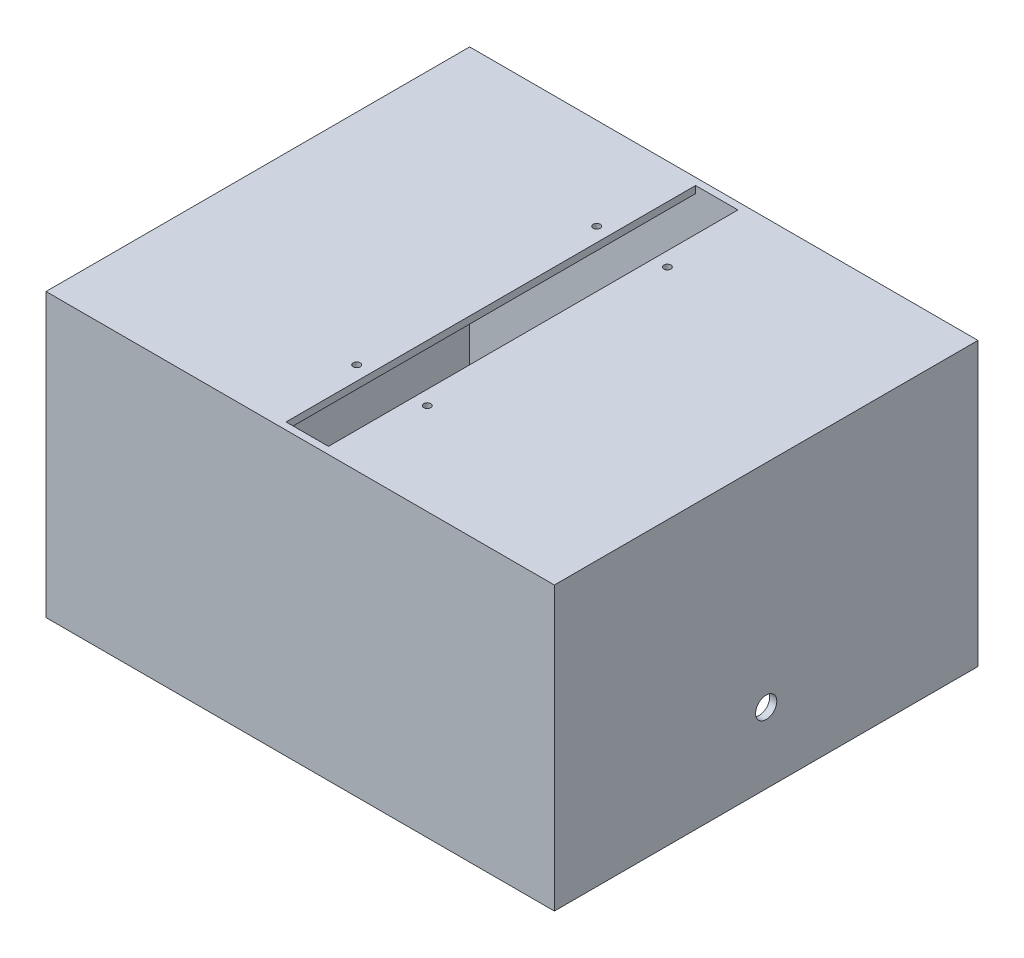
ISO-10303-21;
HEADER;
FILE_DESCRIPTION(('STEP AP214'),'2;1');
FILE_NAME('part.step','',(''),(''),'','','');
FILE_SCHEMA(('AUTOMOTIVE_DESIGN { 1 0 10303 214 1 1 1 1 }'));
ENDSEC;
DATA;
#1=APPLICATION_CONTEXT('core data for automotive mechanical design processes');
#2=APPLICATION_PROTOCOL_DEFINITION('international standard','automotive_design',2000,#1);
#3=PRODUCT_CONTEXT('',#1,'mechanical');
#4=PRODUCT('Part','Part','',(#3));
#5=PRODUCT_RELATED_PRODUCT_CATEGORY('part','',(#4));
#6=PRODUCT_DEFINITION_FORMATION('','',#4);
#7=PRODUCT_DEFINITION_CONTEXT('part definition',#1,'design');
#8=PRODUCT_DEFINITION('design','',#6,#7);
#9=PRODUCT_DEFINITION_SHAPE('','',#8);
#10=(LENGTH_UNIT() NAMED_UNIT(*) SI_UNIT(.MILLI.,.METRE.));
#11=(NAMED_UNIT(*) PLANE_ANGLE_UNIT() SI_UNIT($,.RADIAN.));
#12=(NAMED_UNIT(*) SI_UNIT($,.STERADIAN.) SOLID_ANGLE_UNIT());
#13=UNCERTAINTY_MEASURE_WITH_UNIT(LENGTH_MEASURE(1.E-05),#10,'distance_accuracy_value','');
#14=(GEOMETRIC_REPRESENTATION_CONTEXT(3) GLOBAL_UNCERTAINTY_ASSIGNED_CONTEXT((#13)) GLOBAL_UNIT_ASSIGNED_CONTEXT((#10,
#11,#12)) REPRESENTATION_CONTEXT('',''));
#15=CARTESIAN_POINT('',(0.,0.,0.));
#16=DIRECTION('',(0.,0.,1.));
#17=DIRECTION('',(1.,0.,0.));
#18=AXIS2_PLACEMENT_3D('',#15,#16,#17);
#19=CARTESIAN_POINT('',(0.,-5.,0.));
#20=DIRECTION('',(0.,1.,0.));
#21=DIRECTION('',(0.,0.,1.));
#22=AXIS2_PLACEMENT_3D('',#19,#20,#21);
#23=PLANE('',#22);
#24=CARTESIAN_POINT('',(25.,-5.,85.));
#25=DIRECTION('',(0.,1.,0.));
#26=DIRECTION('',(0.,0.,1.));
#27=AXIS2_PLACEMENT_3D('',#24,#25,#26);
#28=CIRCLE('',#27,2.5);
#29=CARTESIAN_POINT('',(25.,-5.,87.5));
#30=VERTEX_POINT('',#29);
#31=EDGE_CURVE('E552',#30,#30,#28,.F.);
#32=ORIENTED_EDGE('',*,*,#31,.F.);
#33=EDGE_LOOP('',(#32));
#34=FACE_BOUND('',#33,.T.);
#35=CARTESIAN_POINT('',(25.0000000000002,-5.,-85.));
#36=DIRECTION('',(0.,1.,0.));
#37=DIRECTION('',(0.,0.,1.));
#38=AXIS2_PLACEMENT_3D('',#35,#36,#37);
#39=CIRCLE('',#38,2.5);
#40=CARTESIAN_POINT('',(25.0000000000002,-5.,-82.5));
#41=VERTEX_POINT('',#40);
#42=EDGE_CURVE('E561',#41,#41,#39,.F.);
#43=ORIENTED_EDGE('',*,*,#42,.F.);
#44=EDGE_LOOP('',(#43));
#45=FACE_BOUND('',#44,.T.);
#46=DIRECTION('',(-1.,0.,0.));
#47=VECTOR('',#46,1.);
#48=CARTESIAN_POINT('',(-175.,-5.,145.));
#49=LINE('',#48,#47);
#50=CARTESIAN_POINT('',(175.,-5.,145.));
#51=VERTEX_POINT('',#50);
#52=CARTESIAN_POINT('',(15.,-5.,145.));
#53=VERTEX_POINT('',#52);
#54=EDGE_CURVE('E174',#51,#53,#49,.T.);
#55=ORIENTED_EDGE('',*,*,#54,.T.);
#56=DIRECTION('',(0.,0.,-1.));
#57=VECTOR('',#56,1.);
#58=CARTESIAN_POINT('',(15.,-5.,0.));
#59=LINE('',#58,#57);
#60=CARTESIAN_POINT('',(15.,-5.,-145.));
#61=VERTEX_POINT('',#60);
#62=EDGE_CURVE('E11',#53,#61,#59,.T.);
#63=ORIENTED_EDGE('',*,*,#62,.T.);
#64=DIRECTION('',(1.,0.,0.));
#65=VECTOR('',#64,1.);
#66=CARTESIAN_POINT('',(-175.,-5.,-145.));
#67=LINE('',#66,#65);
#68=CARTESIAN_POINT('',(175.,-5.,-145.));
#69=VERTEX_POINT('',#68);
#70=EDGE_CURVE('E182',#61,#69,#67,.T.);
#71=ORIENTED_EDGE('',*,*,#70,.T.);
#72=DIRECTION('',(0.,0.,1.));
#73=VECTOR('',#72,1.);
#74=CARTESIAN_POINT('',(175.,-5.,-145.));
#75=LINE('',#74,#73);
#76=EDGE_CURVE('E168',#69,#51,#75,.T.);
#77=ORIENTED_EDGE('',*,*,#76,.T.);
#78=EDGE_LOOP('',(#55,#63,#71,#77));
#79=FACE_BOUND('',#78,.T.);
#80=ADVANCED_FACE('F42',(#34,#45,#79),#23,.F.);
#81=CARTESIAN_POINT('',(-180.,-200.,150.));
#82=DIRECTION('',(-1.,0.,0.));
#83=DIRECTION('',(0.,0.,1.));
#84=AXIS2_PLACEMENT_3D('',#81,#82,#83);
#85=PLANE('',#84);
#86=CARTESIAN_POINT('',(-180.,-150.,0.));
#87=DIRECTION('',(-1.,0.,0.));
#88=DIRECTION('',(0.,0.,1.));
#89=AXIS2_PLACEMENT_3D('',#86,#87,#88);
#90=CIRCLE('',#89,7.5);
#91=CARTESIAN_POINT('',(-180.,-150.,7.50000000000002));
#92=VERTEX_POINT('',#91);
#93=EDGE_CURVE('E522',#92,#92,#90,.T.);
#94=ORIENTED_EDGE('',*,*,#93,.F.);
#95=EDGE_LOOP('',(#94));
#96=FACE_BOUND('',#95,.T.);
#97=DIRECTION('',(0.,0.,1.));
#98=VECTOR('',#97,1.);
#99=CARTESIAN_POINT('',(-180.,0.,150.));
#100=LINE('',#99,#98);
#101=CARTESIAN_POINT('',(-180.,0.,-150.));
#102=VERTEX_POINT('',#101);
#103=CARTESIAN_POINT('',(-180.,0.,150.));
#104=VERTEX_POINT('',#103);
#105=EDGE_CURVE('E202',#102,#104,#100,.T.);
#106=ORIENTED_EDGE('',*,*,#105,.F.);
#107=DIRECTION('',(0.,1.,0.));
#108=VECTOR('',#107,1.);
#109=CARTESIAN_POINT('',(-180.,-200.,-150.));
#110=LINE('',#109,#108);
#111=CARTESIAN_POINT('',(-180.,-200.,-150.));
#112=VERTEX_POINT('',#111);
#113=EDGE_CURVE('E245',#112,#102,#110,.T.);
#114=ORIENTED_EDGE('',*,*,#113,.F.);
#115=DIRECTION('',(0.,0.,1.));
#116=VECTOR('',#115,1.);
#117=CARTESIAN_POINT('',(-180.,-200.,150.));
#118=LINE('',#117,#116);
#119=CARTESIAN_POINT('',(-180.,-200.,150.));
#120=VERTEX_POINT('',#119);
#121=EDGE_CURVE('E213',#112,#120,#118,.T.);
#122=ORIENTED_EDGE('',*,*,#121,.T.);
#123=DIRECTION('',(0.,1.,0.));
#124=VECTOR('',#123,1.);
#125=CARTESIAN_POINT('',(-180.,-200.,150.));
#126=LINE('',#125,#124);
#127=EDGE_CURVE('E230',#120,#104,#126,.T.);
#128=ORIENTED_EDGE('',*,*,#127,.T.);
#129=EDGE_LOOP('',(#106,#114,#122,#128));
#130=FACE_BOUND('',#129,.T.);
#131=ADVANCED_FACE('F44',(#96,#130),#85,.T.);
#132=CARTESIAN_POINT('',(-180.,-200.,-150.));
#133=DIRECTION('',(0.,0.,-1.));
#134=DIRECTION('',(-1.,0.,0.));
#135=AXIS2_PLACEMENT_3D('',#132,#133,#134);
#136=PLANE('',#135);
#137=DIRECTION('',(-1.,0.,0.));
#138=VECTOR('',#137,1.);
#139=CARTESIAN_POINT('',(-180.,0.,-150.));
#140=LINE('',#139,#138);
#141=CARTESIAN_POINT('',(180.,0.,-150.));
#142=VERTEX_POINT('',#141);
#143=EDGE_CURVE('E218',#142,#102,#140,.T.);
#144=ORIENTED_EDGE('',*,*,#143,.F.);
#145=DIRECTION('',(0.,1.,0.));
#146=VECTOR('',#145,1.);
#147=CARTESIAN_POINT('',(180.,-200.,-150.));
#148=LINE('',#147,#146);
#149=CARTESIAN_POINT('',(180.,-200.,-150.));
#150=VERTEX_POINT('',#149);
#151=EDGE_CURVE('E248',#150,#142,#148,.T.);
#152=ORIENTED_EDGE('',*,*,#151,.F.);
#153=DIRECTION('',(-1.,0.,0.));
#154=VECTOR('',#153,1.);
#155=CARTESIAN_POINT('',(-180.,-200.,-150.));
#156=LINE('',#155,#154);
#157=EDGE_CURVE('E226',#150,#112,#156,.T.);
#158=ORIENTED_EDGE('',*,*,#157,.T.);
#159=ORIENTED_EDGE('',*,*,#113,.T.);
#160=EDGE_LOOP('',(#144,#152,#158,#159));
#161=FACE_BOUND('',#160,.T.);
#162=ADVANCED_FACE('F295',(#161),#136,.T.);
#163=CARTESIAN_POINT('',(180.,-200.,150.));
#164=DIRECTION('',(1.,0.,0.));
#165=DIRECTION('',(0.,0.,-1.));
#166=AXIS2_PLACEMENT_3D('',#163,#164,#165);
#167=PLANE('',#166);
#168=CARTESIAN_POINT('',(180.,-150.,0.));
#169=DIRECTION('',(-1.,0.,0.));
#170=DIRECTION('',(0.,0.,1.));
#171=AXIS2_PLACEMENT_3D('',#168,#169,#170);
#172=CIRCLE('',#171,7.5);
#173=CARTESIAN_POINT('',(180.,-150.,7.50000000000002));
#174=VERTEX_POINT('',#173);
#175=EDGE_CURVE('E527',#174,#174,#172,.T.);
#176=ORIENTED_EDGE('',*,*,#175,.T.);
#177=EDGE_LOOP('',(#176));
#178=FACE_BOUND('',#177,.T.);
#179=DIRECTION('',(0.,0.,-1.));
#180=VECTOR('',#179,1.);
#181=CARTESIAN_POINT('',(180.,0.,150.));
#182=LINE('',#181,#180);
#183=CARTESIAN_POINT('',(180.,0.,150.));
#184=VERTEX_POINT('',#183);
#185=EDGE_CURVE('E238',#184,#142,#182,.T.);
#186=ORIENTED_EDGE('',*,*,#185,.F.);
#187=DIRECTION('',(0.,1.,0.));
#188=VECTOR('',#187,1.);
#189=CARTESIAN_POINT('',(180.,-200.,150.));
#190=LINE('',#189,#188);
#191=CARTESIAN_POINT('',(180.,-200.,150.));
#192=VERTEX_POINT('',#191);
#193=EDGE_CURVE('E251',#192,#184,#190,.T.);
#194=ORIENTED_EDGE('',*,*,#193,.F.);
#195=DIRECTION('',(0.,0.,-1.));
#196=VECTOR('',#195,1.);
#197=CARTESIAN_POINT('',(180.,-200.,150.));
#198=LINE('',#197,#196);
#199=EDGE_CURVE('E222',#192,#150,#198,.T.);
#200=ORIENTED_EDGE('',*,*,#199,.T.);
#201=ORIENTED_EDGE('',*,*,#151,.T.);
#202=EDGE_LOOP('',(#186,#194,#200,#201));
#203=FACE_BOUND('',#202,.T.);
#204=ADVANCED_FACE('F320',(#178,#203),#167,.T.);
#205=CARTESIAN_POINT('',(-180.,-200.,150.));
#206=DIRECTION('',(0.,0.,1.));
#207=DIRECTION('',(1.,0.,0.));
#208=AXIS2_PLACEMENT_3D('',#205,#206,#207);
#209=PLANE('',#208);
#210=DIRECTION('',(1.,0.,0.));
#211=VECTOR('',#210,1.);
#212=CARTESIAN_POINT('',(-180.,0.,150.));
#213=LINE('',#212,#211);
#214=EDGE_CURVE('E234',#104,#184,#213,.T.);
#215=ORIENTED_EDGE('',*,*,#214,.F.);
#216=ORIENTED_EDGE('',*,*,#127,.F.);
#217=DIRECTION('',(1.,0.,0.));
#218=VECTOR('',#217,1.);
#219=CARTESIAN_POINT('',(-180.,-200.,150.));
#220=LINE('',#219,#218);
#221=EDGE_CURVE('E217',#120,#192,#220,.T.);
#222=ORIENTED_EDGE('',*,*,#221,.T.);
#223=ORIENTED_EDGE('',*,*,#193,.T.);
#224=EDGE_LOOP('',(#215,#216,#222,#223));
#225=FACE_BOUND('',#224,.T.);
#226=ADVANCED_FACE('F314',(#225),#209,.T.);
#227=CARTESIAN_POINT('',(0.,-200.,0.));
#228=DIRECTION('',(0.,-1.,0.));
#229=DIRECTION('',(0.,0.,-1.));
#230=AXIS2_PLACEMENT_3D('',#227,#228,#229);
#231=PLANE('',#230);
#232=DIRECTION('',(0.,0.,1.));
#233=VECTOR('',#232,1.);
#234=CARTESIAN_POINT('',(175.,-200.,-145.));
#235=LINE('',#234,#233);
#236=CARTESIAN_POINT('',(175.,-200.,-145.));
#237=VERTEX_POINT('',#236);
#238=CARTESIAN_POINT('',(175.,-200.,145.));
#239=VERTEX_POINT('',#238);
#240=EDGE_CURVE('E163',#237,#239,#235,.T.);
#241=ORIENTED_EDGE('',*,*,#240,.F.);
#242=DIRECTION('',(1.,0.,0.));
#243=VECTOR('',#242,1.);
#244=CARTESIAN_POINT('',(-175.,-200.,-145.));
#245=LINE('',#244,#243);
#246=CARTESIAN_POINT('',(-175.,-200.,-145.));
#247=VERTEX_POINT('',#246);
#248=EDGE_CURVE('E173',#247,#237,#245,.T.);
#249=ORIENTED_EDGE('',*,*,#248,.F.);
#250=DIRECTION('',(0.,0.,-1.));
#251=VECTOR('',#250,1.);
#252=CARTESIAN_POINT('',(-175.,-200.,-145.));
#253=LINE('',#252,#251);
#254=CARTESIAN_POINT('',(-175.,-200.,145.));
#255=VERTEX_POINT('',#254);
#256=EDGE_CURVE('E192',#255,#247,#253,.T.);
#257=ORIENTED_EDGE('',*,*,#256,.F.);
#258=DIRECTION('',(-1.,0.,0.));
#259=VECTOR('',#258,1.);
#260=CARTESIAN_POINT('',(-175.,-200.,145.));
#261=LINE('',#260,#259);
#262=EDGE_CURVE('E189',#239,#255,#261,.T.);
#263=ORIENTED_EDGE('',*,*,#262,.F.);
#264=EDGE_LOOP('',(#241,#249,#257,#263));
#265=FACE_BOUND('',#264,.T.);
#266=ORIENTED_EDGE('',*,*,#121,.F.);
#267=ORIENTED_EDGE('',*,*,#157,.F.);
#268=ORIENTED_EDGE('',*,*,#199,.F.);
#269=ORIENTED_EDGE('',*,*,#221,.F.);
#270=EDGE_LOOP('',(#266,#267,#268,#269));
#271=FACE_BOUND('',#270,.T.);
#272=ADVANCED_FACE('F311',(#265,#271),#231,.T.);
#273=CARTESIAN_POINT('',(0.,0.,0.));
#274=DIRECTION('',(0.,-1.,0.));
#275=DIRECTION('',(0.,0.,-1.));
#276=AXIS2_PLACEMENT_3D('',#273,#274,#275);
#277=PLANE('',#276);
#278=CARTESIAN_POINT('',(-25.0000000000001,0.,85.));
#279=DIRECTION('',(0.,1.,0.));
#280=DIRECTION('',(0.,0.,-1.));
#281=AXIS2_PLACEMENT_3D('',#278,#279,#280);
#282=CIRCLE('',#281,2.5);
#283=CARTESIAN_POINT('',(-25.0000000000001,0.,82.5));
#284=VERTEX_POINT('',#283);
#285=EDGE_CURVE('E548',#284,#284,#282,.T.);
#286=ORIENTED_EDGE('',*,*,#285,.F.);
#287=EDGE_LOOP('',(#286));
#288=FACE_BOUND('',#287,.T.);
#289=CARTESIAN_POINT('',(25.,0.,85.));
#290=DIRECTION('',(0.,1.,0.));
#291=DIRECTION('',(0.,0.,1.));
#292=AXIS2_PLACEMENT_3D('',#289,#290,#291);
#293=CIRCLE('',#292,2.5);
#294=CARTESIAN_POINT('',(25.,0.,87.5));
#295=VERTEX_POINT('',#294);
#296=EDGE_CURVE('E557',#295,#295,#293,.T.);
#297=ORIENTED_EDGE('',*,*,#296,.F.);
#298=EDGE_LOOP('',(#297));
#299=FACE_BOUND('',#298,.T.);
#300=CARTESIAN_POINT('',(25.0000000000002,0.,-85.));
#301=DIRECTION('',(0.,1.,0.));
#302=DIRECTION('',(0.,0.,-1.));
#303=AXIS2_PLACEMENT_3D('',#300,#301,#302);
#304=CIRCLE('',#303,2.5);
#305=CARTESIAN_POINT('',(25.0000000000002,0.,-87.5));
#306=VERTEX_POINT('',#305);
#307=EDGE_CURVE('E547',#306,#306,#304,.T.);
#308=ORIENTED_EDGE('',*,*,#307,.F.);
#309=EDGE_LOOP('',(#308));
#310=FACE_BOUND('',#309,.T.);
#311=CARTESIAN_POINT('',(-25.,0.,-85.));
#312=DIRECTION('',(0.,1.,0.));
#313=DIRECTION('',(0.,0.,1.));
#314=AXIS2_PLACEMENT_3D('',#311,#312,#313);
#315=CIRCLE('',#314,2.5);
#316=CARTESIAN_POINT('',(-25.,0.,-82.5));
#317=VERTEX_POINT('',#316);
#318=EDGE_CURVE('E543',#317,#317,#315,.T.);
#319=ORIENTED_EDGE('',*,*,#318,.F.);
#320=EDGE_LOOP('',(#319));
#321=FACE_BOUND('',#320,.T.);
#322=DIRECTION('',(-1.,0.,0.));
#323=VECTOR('',#322,1.);
#324=CARTESIAN_POINT('',(-15.,0.,-145.));
#325=LINE('',#324,#323);
#326=CARTESIAN_POINT('',(15.,0.,-145.));
#327=VERTEX_POINT('',#326);
#328=CARTESIAN_POINT('',(-15.,0.,-145.));
#329=VERTEX_POINT('',#328);
#330=EDGE_CURVE('E144',#327,#329,#325,.T.);
#331=ORIENTED_EDGE('',*,*,#330,.F.);
#332=DIRECTION('',(0.,0.,-1.));
#333=VECTOR('',#332,1.);
#334=CARTESIAN_POINT('',(15.,0.,145.));
#335=LINE('',#334,#333);
#336=CARTESIAN_POINT('',(15.,0.,145.));
#337=VERTEX_POINT('',#336);
#338=EDGE_CURVE('E59',#337,#327,#335,.T.);
#339=ORIENTED_EDGE('',*,*,#338,.F.);
#340=DIRECTION('',(1.,0.,0.));
#341=VECTOR('',#340,1.);
#342=CARTESIAN_POINT('',(-15.,0.,145.));
#343=LINE('',#342,#341);
#344=CARTESIAN_POINT('',(-15.,0.,145.));
#345=VERTEX_POINT('',#344);
#346=EDGE_CURVE('E153',#345,#337,#343,.T.);
#347=ORIENTED_EDGE('',*,*,#346,.F.);
#348=DIRECTION('',(0.,0.,1.));
#349=VECTOR('',#348,1.);
#350=CARTESIAN_POINT('',(-15.,0.,145.));
#351=LINE('',#350,#349);
#352=EDGE_CURVE('E135',#329,#345,#351,.T.);
#353=ORIENTED_EDGE('',*,*,#352,.F.);
#354=EDGE_LOOP('',(#331,#339,#347,#353));
#355=FACE_BOUND('',#354,.T.);
#356=ORIENTED_EDGE('',*,*,#105,.T.);
#357=ORIENTED_EDGE('',*,*,#214,.T.);
#358=ORIENTED_EDGE('',*,*,#185,.T.);
#359=ORIENTED_EDGE('',*,*,#143,.T.);
#360=EDGE_LOOP('',(#356,#357,#358,#359));
#361=FACE_BOUND('',#360,.T.);
#362=ADVANCED_FACE('F150',(#288,#299,#310,#321,#355,#361),#277,.F.);
#363=CARTESIAN_POINT('',(175.,-5.,-145.));
#364=DIRECTION('',(1.,0.,0.));
#365=DIRECTION('',(0.,0.,-1.));
#366=AXIS2_PLACEMENT_3D('',#363,#364,#365);
#367=PLANE('',#366);
#368=CARTESIAN_POINT('',(175.,-150.,0.));
#369=DIRECTION('',(1.,0.,0.));
#370=DIRECTION('',(0.,0.,-1.));
#371=AXIS2_PLACEMENT_3D('',#368,#369,#370);
#372=CIRCLE('',#371,7.5);
#373=CARTESIAN_POINT('',(175.,-150.,-7.49999999999998));
#374=VERTEX_POINT('',#373);
#375=EDGE_CURVE('E526',#374,#374,#372,.T.);
#376=ORIENTED_EDGE('',*,*,#375,.T.);
#377=EDGE_LOOP('',(#376));
#378=FACE_BOUND('',#377,.T.);
#379=ORIENTED_EDGE('',*,*,#240,.T.);
#380=DIRECTION('',(0.,-1.,0.));
#381=VECTOR('',#380,1.);
#382=CARTESIAN_POINT('',(175.,-5.,145.));
#383=LINE('',#382,#381);
#384=EDGE_CURVE('E186',#51,#239,#383,.T.);
#385=ORIENTED_EDGE('',*,*,#384,.F.);
#386=ORIENTED_EDGE('',*,*,#76,.F.);
#387=DIRECTION('',(0.,-1.,0.));
#388=VECTOR('',#387,1.);
#389=CARTESIAN_POINT('',(175.,-5.,-145.));
#390=LINE('',#389,#388);
#391=EDGE_CURVE('E198',#69,#237,#390,.T.);
#392=ORIENTED_EDGE('',*,*,#391,.T.);
#393=EDGE_LOOP('',(#379,#385,#386,#392));
#394=FACE_BOUND('',#393,.T.);
#395=ADVANCED_FACE('F272',(#378,#394),#367,.F.);
#396=CARTESIAN_POINT('',(-175.,-5.,-145.));
#397=DIRECTION('',(0.,0.,-1.));
#398=DIRECTION('',(-1.,0.,0.));
#399=AXIS2_PLACEMENT_3D('',#396,#397,#398);
#400=PLANE('',#399);
#401=ORIENTED_EDGE('',*,*,#248,.T.);
#402=ORIENTED_EDGE('',*,*,#391,.F.);
#403=ORIENTED_EDGE('',*,*,#70,.F.);
#404=DIRECTION('',(0.,1.,0.));
#405=VECTOR('',#404,1.);
#406=CARTESIAN_POINT('',(15.,-200.,-145.));
#407=LINE('',#406,#405);
#408=EDGE_CURVE('E141',#61,#327,#407,.T.);
#409=ORIENTED_EDGE('',*,*,#408,.T.);
#410=ORIENTED_EDGE('',*,*,#330,.T.);
#411=DIRECTION('',(0.,1.,0.));
#412=VECTOR('',#411,1.);
#413=CARTESIAN_POINT('',(-15.,-200.,-145.));
#414=LINE('',#413,#412);
#415=CARTESIAN_POINT('',(-15.,-5.,-145.));
#416=VERTEX_POINT('',#415);
#417=EDGE_CURVE('E67',#416,#329,#414,.T.);
#418=ORIENTED_EDGE('',*,*,#417,.F.);
#419=CARTESIAN_POINT('',(-175.,-5.,-145.));
#420=VERTEX_POINT('',#419);
#421=EDGE_CURVE('E183',#420,#416,#67,.T.);
#422=ORIENTED_EDGE('',*,*,#421,.F.);
#423=DIRECTION('',(0.,-1.,0.));
#424=VECTOR('',#423,1.);
#425=CARTESIAN_POINT('',(-175.,-5.,-145.));
#426=LINE('',#425,#424);
#427=EDGE_CURVE('E203',#420,#247,#426,.T.);
#428=ORIENTED_EDGE('',*,*,#427,.T.);
#429=EDGE_LOOP('',(#401,#402,#403,#409,#410,#418,#422,#428));
#430=FACE_BOUND('',#429,.T.);
#431=ADVANCED_FACE('F145',(#430),#400,.F.);
#432=CARTESIAN_POINT('',(-175.,-5.,-145.));
#433=DIRECTION('',(-1.,0.,0.));
#434=DIRECTION('',(0.,0.,1.));
#435=AXIS2_PLACEMENT_3D('',#432,#433,#434);
#436=PLANE('',#435);
#437=CARTESIAN_POINT('',(-175.,-150.,0.));
#438=DIRECTION('',(-1.,0.,0.));
#439=DIRECTION('',(0.,0.,1.));
#440=AXIS2_PLACEMENT_3D('',#437,#438,#439);
#441=CIRCLE('',#440,7.5);
#442=CARTESIAN_POINT('',(-175.,-150.,7.50000000000002));
#443=VERTEX_POINT('',#442);
#444=EDGE_CURVE('E46',#443,#443,#441,.T.);
#445=ORIENTED_EDGE('',*,*,#444,.T.);
#446=EDGE_LOOP('',(#445));
#447=FACE_BOUND('',#446,.T.);
#448=ORIENTED_EDGE('',*,*,#256,.T.);
#449=ORIENTED_EDGE('',*,*,#427,.F.);
#450=DIRECTION('',(0.,0.,-1.));
#451=VECTOR('',#450,1.);
#452=CARTESIAN_POINT('',(-175.,-5.,-145.));
#453=LINE('',#452,#451);
#454=CARTESIAN_POINT('',(-175.,-5.,145.));
#455=VERTEX_POINT('',#454);
#456=EDGE_CURVE('E178',#455,#420,#453,.T.);
#457=ORIENTED_EDGE('',*,*,#456,.F.);
#458=DIRECTION('',(0.,-1.,0.));
#459=VECTOR('',#458,1.);
#460=CARTESIAN_POINT('',(-175.,-5.,145.));
#461=LINE('',#460,#459);
#462=EDGE_CURVE('E206',#455,#255,#461,.T.);
#463=ORIENTED_EDGE('',*,*,#462,.T.);
#464=EDGE_LOOP('',(#448,#449,#457,#463));
#465=FACE_BOUND('',#464,.T.);
#466=ADVANCED_FACE('F302',(#447,#465),#436,.F.);
#467=CARTESIAN_POINT('',(-175.,-5.,145.));
#468=DIRECTION('',(0.,0.,1.));
#469=DIRECTION('',(1.,0.,0.));
#470=AXIS2_PLACEMENT_3D('',#467,#468,#469);
#471=PLANE('',#470);
#472=CARTESIAN_POINT('',(-15.,-5.,145.));
#473=VERTEX_POINT('',#472);
#474=EDGE_CURVE('E172',#473,#455,#49,.T.);
#475=ORIENTED_EDGE('',*,*,#474,.F.);
#476=DIRECTION('',(0.,1.,0.));
#477=VECTOR('',#476,1.);
#478=CARTESIAN_POINT('',(-15.,-200.,145.));
#479=LINE('',#478,#477);
#480=EDGE_CURVE('E140',#473,#345,#479,.T.);
#481=ORIENTED_EDGE('',*,*,#480,.T.);
#482=ORIENTED_EDGE('',*,*,#346,.T.);
#483=DIRECTION('',(0.,1.,0.));
#484=VECTOR('',#483,1.);
#485=CARTESIAN_POINT('',(15.,-200.,145.));
#486=LINE('',#485,#484);
#487=EDGE_CURVE('E160',#53,#337,#486,.T.);
#488=ORIENTED_EDGE('',*,*,#487,.F.);
#489=ORIENTED_EDGE('',*,*,#54,.F.);
#490=ORIENTED_EDGE('',*,*,#384,.T.);
#491=ORIENTED_EDGE('',*,*,#262,.T.);
#492=ORIENTED_EDGE('',*,*,#462,.F.);
#493=EDGE_LOOP('',(#475,#481,#482,#488,#489,#490,#491,#492));
#494=FACE_BOUND('',#493,.T.);
#495=ADVANCED_FACE('F262',(#494),#471,.F.);
#496=CARTESIAN_POINT('',(-25.0000000000001,-5.,85.));
#497=DIRECTION('',(0.,1.,0.));
#498=DIRECTION('',(0.,0.,1.));
#499=AXIS2_PLACEMENT_3D('',#496,#497,#498);
#500=CIRCLE('',#499,2.5);
#501=CARTESIAN_POINT('',(-25.0000000000001,-5.,87.5));
#502=VERTEX_POINT('',#501);
#503=EDGE_CURVE('E553',#502,#502,#500,.F.);
#504=ORIENTED_EDGE('',*,*,#503,.F.);
#505=EDGE_LOOP('',(#504));
#506=FACE_BOUND('',#505,.T.);
#507=CARTESIAN_POINT('',(-25.,-5.,-85.));
#508=DIRECTION('',(0.,1.,0.));
#509=DIRECTION('',(0.,0.,1.));
#510=AXIS2_PLACEMENT_3D('',#507,#508,#509);
#511=CIRCLE('',#510,2.5);
#512=CARTESIAN_POINT('',(-25.,-5.,-82.5));
#513=VERTEX_POINT('',#512);
#514=EDGE_CURVE('E536',#513,#513,#511,.F.);
#515=ORIENTED_EDGE('',*,*,#514,.F.);
#516=EDGE_LOOP('',(#515));
#517=FACE_BOUND('',#516,.T.);
#518=ORIENTED_EDGE('',*,*,#421,.T.);
#519=DIRECTION('',(0.,0.,1.));
#520=VECTOR('',#519,1.);
#521=CARTESIAN_POINT('',(-15.,-5.,0.));
#522=LINE('',#521,#520);
#523=EDGE_CURVE('E52',#416,#473,#522,.T.);
#524=ORIENTED_EDGE('',*,*,#523,.T.);
#525=ORIENTED_EDGE('',*,*,#474,.T.);
#526=ORIENTED_EDGE('',*,*,#456,.T.);
#527=EDGE_LOOP('',(#518,#524,#525,#526));
#528=FACE_BOUND('',#527,.T.);
#529=ADVANCED_FACE('F259',(#506,#517,#528),#23,.F.);
#530=CARTESIAN_POINT('',(15.,-200.,145.));
#531=DIRECTION('',(1.,0.,0.));
#532=DIRECTION('',(0.,0.,-1.));
#533=AXIS2_PLACEMENT_3D('',#530,#531,#532);
#534=PLANE('',#533);
#535=ORIENTED_EDGE('',*,*,#487,.T.);
#536=ORIENTED_EDGE('',*,*,#338,.T.);
#537=ORIENTED_EDGE('',*,*,#408,.F.);
#538=ORIENTED_EDGE('',*,*,#62,.F.);
#539=EDGE_LOOP('',(#535,#536,#537,#538));
#540=FACE_BOUND('',#539,.T.);
#541=ADVANCED_FACE('F276',(#540),#534,.F.);
#542=CARTESIAN_POINT('',(-15.,-200.,145.));
#543=DIRECTION('',(-1.,0.,0.));
#544=DIRECTION('',(0.,0.,1.));
#545=AXIS2_PLACEMENT_3D('',#542,#543,#544);
#546=PLANE('',#545);
#547=ORIENTED_EDGE('',*,*,#417,.T.);
#548=ORIENTED_EDGE('',*,*,#352,.T.);
#549=ORIENTED_EDGE('',*,*,#480,.F.);
#550=ORIENTED_EDGE('',*,*,#523,.F.);
#551=EDGE_LOOP('',(#547,#548,#549,#550));
#552=FACE_BOUND('',#551,.T.);
#553=ADVANCED_FACE('F133',(#552),#546,.F.);
#554=CARTESIAN_POINT('',(180.,-150.,0.));
#555=DIRECTION('',(-1.,0.,0.));
#556=DIRECTION('',(0.,0.,1.));
#557=AXIS2_PLACEMENT_3D('',#554,#555,#556);
#558=CYLINDRICAL_SURFACE('',#557,7.5);
#559=ORIENTED_EDGE('',*,*,#93,.T.);
#560=EDGE_LOOP('',(#559));
#561=FACE_BOUND('',#560,.T.);
#562=ORIENTED_EDGE('',*,*,#444,.F.);
#563=EDGE_LOOP('',(#562));
#564=FACE_BOUND('',#563,.T.);
#565=ADVANCED_FACE('F283',(#561,#564),#558,.F.);
#566=ORIENTED_EDGE('',*,*,#175,.F.);
#567=EDGE_LOOP('',(#566));
#568=FACE_BOUND('',#567,.T.);
#569=ORIENTED_EDGE('',*,*,#375,.F.);
#570=EDGE_LOOP('',(#569));
#571=FACE_BOUND('',#570,.T.);
#572=ADVANCED_FACE('F387',(#568,#571),#558,.F.);
#573=CARTESIAN_POINT('',(-25.,-12.0710678118655,-85.));
#574=DIRECTION('',(0.,1.,0.));
#575=DIRECTION('',(0.,0.,1.));
#576=AXIS2_PLACEMENT_3D('',#573,#574,#575);
#577=CYLINDRICAL_SURFACE('',#576,2.5);
#578=ORIENTED_EDGE('',*,*,#514,.T.);
#579=EDGE_LOOP('',(#578));
#580=FACE_BOUND('',#579,.T.);
#581=ORIENTED_EDGE('',*,*,#318,.T.);
#582=EDGE_LOOP('',(#581));
#583=FACE_BOUND('',#582,.T.);
#584=ADVANCED_FACE('F381',(#580,#583),#577,.F.);
#585=CARTESIAN_POINT('',(-25.0000000000001,-12.0710678118655,85.));
#586=DIRECTION('',(0.,1.,0.));
#587=DIRECTION('',(0.,0.,1.));
#588=AXIS2_PLACEMENT_3D('',#585,#586,#587);
#589=CYLINDRICAL_SURFACE('',#588,2.5);
#590=ORIENTED_EDGE('',*,*,#503,.T.);
#591=EDGE_LOOP('',(#590));
#592=FACE_BOUND('',#591,.T.);
#593=ORIENTED_EDGE('',*,*,#285,.T.);
#594=EDGE_LOOP('',(#593));
#595=FACE_BOUND('',#594,.T.);
#596=ADVANCED_FACE('F386',(#592,#595),#589,.F.);
#597=CARTESIAN_POINT('',(25.0000000000002,-12.0710678118655,-85.));
#598=DIRECTION('',(0.,1.,0.));
#599=DIRECTION('',(0.,0.,1.));
#600=AXIS2_PLACEMENT_3D('',#597,#598,#599);
#601=CYLINDRICAL_SURFACE('',#600,2.5);
#602=ORIENTED_EDGE('',*,*,#42,.T.);
#603=EDGE_LOOP('',(#602));
#604=FACE_BOUND('',#603,.T.);
#605=ORIENTED_EDGE('',*,*,#307,.T.);
#606=EDGE_LOOP('',(#605));
#607=FACE_BOUND('',#606,.T.);
#608=ADVANCED_FACE('F400',(#604,#607),#601,.F.);
#609=CARTESIAN_POINT('',(25.,-12.0710678118655,85.));
#610=DIRECTION('',(0.,1.,0.));
#611=DIRECTION('',(0.,0.,1.));
#612=AXIS2_PLACEMENT_3D('',#609,#610,#611);
#613=CYLINDRICAL_SURFACE('',#612,2.5);
#614=ORIENTED_EDGE('',*,*,#31,.T.);
#615=EDGE_LOOP('',(#614));
#616=FACE_BOUND('',#615,.T.);
#617=ORIENTED_EDGE('',*,*,#296,.T.);
#618=EDGE_LOOP('',(#617));
#619=FACE_BOUND('',#618,.T.);
#620=ADVANCED_FACE('F411',(#616,#619),#613,.F.);
#621=CLOSED_SHELL('',(#80,#131,#162,#204,#226,#272,#362,#395,#431,#466,#495,#529,#541,#553,#565,
#572,#584,#596,#608,#620));
#622=MANIFOLD_SOLID_BREP('B2',#621);
#623=ADVANCED_BREP_SHAPE_REPRESENTATION('',(#18,#622),#14);
#624=SHAPE_DEFINITION_REPRESENTATION(#9,#623);
ENDSEC;
END-ISO-10303-21;
